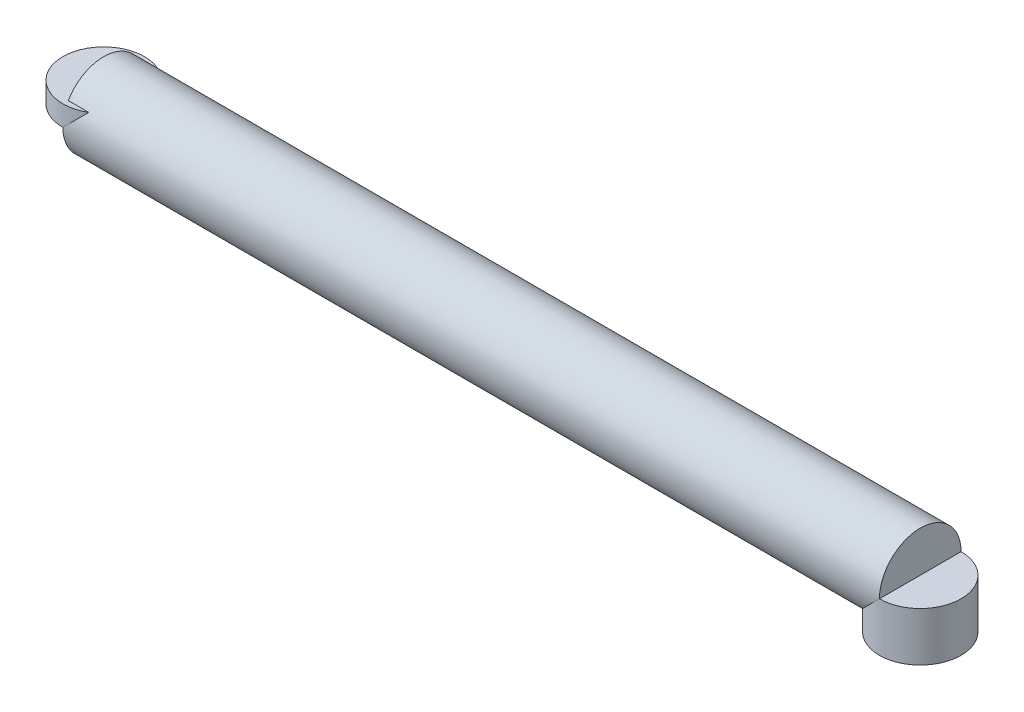
ISO-10303-21;
HEADER;
FILE_DESCRIPTION(('STEP AP214'),'2;1');
FILE_NAME('part.step','',(''),(''),'','','');
FILE_SCHEMA(('AUTOMOTIVE_DESIGN { 1 0 10303 214 1 1 1 1 }'));
ENDSEC;
DATA;
#1=APPLICATION_CONTEXT('core data for automotive mechanical design processes');
#2=APPLICATION_PROTOCOL_DEFINITION('international standard','automotive_design',2000,#1);
#3=PRODUCT_CONTEXT('',#1,'mechanical');
#4=PRODUCT('Part','Part','',(#3));
#5=PRODUCT_RELATED_PRODUCT_CATEGORY('part','',(#4));
#6=PRODUCT_DEFINITION_FORMATION('','',#4);
#7=PRODUCT_DEFINITION_CONTEXT('part definition',#1,'design');
#8=PRODUCT_DEFINITION('design','',#6,#7);
#9=PRODUCT_DEFINITION_SHAPE('','',#8);
#10=(LENGTH_UNIT() NAMED_UNIT(*) SI_UNIT(.MILLI.,.METRE.));
#11=(NAMED_UNIT(*) PLANE_ANGLE_UNIT() SI_UNIT($,.RADIAN.));
#12=(NAMED_UNIT(*) SI_UNIT($,.STERADIAN.) SOLID_ANGLE_UNIT());
#13=UNCERTAINTY_MEASURE_WITH_UNIT(LENGTH_MEASURE(1.E-05),#10,'distance_accuracy_value','');
#14=(GEOMETRIC_REPRESENTATION_CONTEXT(3) GLOBAL_UNCERTAINTY_ASSIGNED_CONTEXT((#13)) GLOBAL_UNIT_ASSIGNED_CONTEXT((#10,
#11,#12)) REPRESENTATION_CONTEXT('',''));
#15=CARTESIAN_POINT('',(0.,0.,0.));
#16=DIRECTION('',(0.,0.,1.));
#17=DIRECTION('',(1.,0.,0.));
#18=AXIS2_PLACEMENT_3D('',#15,#16,#17);
#19=CARTESIAN_POINT('',(24.,73.,16.7));
#20=DIRECTION('',(-1.,0.,0.));
#21=DIRECTION('',(0.,0.,1.));
#22=AXIS2_PLACEMENT_3D('',#19,#20,#21);
#23=CYLINDRICAL_SURFACE('',#22,1.);
#24=CARTESIAN_POINT('',(24.,73.,16.7));
#25=DIRECTION('',(1.,0.,0.));
#26=DIRECTION('',(0.,0.,-1.));
#27=AXIS2_PLACEMENT_3D('',#24,#25,#26);
#28=CIRCLE('',#27,1.);
#29=CARTESIAN_POINT('',(24.,73.,15.7));
#30=VERTEX_POINT('',#29);
#31=CARTESIAN_POINT('',(24.,73.,17.7));
#32=VERTEX_POINT('',#31);
#33=EDGE_CURVE('E103',#30,#32,#28,.T.);
#34=ORIENTED_EDGE('',*,*,#33,.F.);
#35=CARTESIAN_POINT('',(24.,73.,16.7));
#36=DIRECTION('',(0.707106781186547,-0.707106781186547,0.));
#37=DIRECTION('',(-0.707106781186547,-0.707106781186547,0.));
#38=AXIS2_PLACEMENT_3D('',#35,#36,#37);
#39=ELLIPSE('',#38,1.4142135623731,1.);
#40=EDGE_CURVE('E105',#30,#32,#39,.F.);
#41=ORIENTED_EDGE('',*,*,#40,.T.);
#42=EDGE_LOOP('',(#34,#41));
#43=FACE_BOUND('',#42,.T.);
#44=CARTESIAN_POINT('',(4.,73.,16.7));
#45=DIRECTION('',(-0.707106781186547,0.707106781186547,0.));
#46=DIRECTION('',(-0.707106781186547,-0.707106781186547,0.));
#47=AXIS2_PLACEMENT_3D('',#44,#45,#46);
#48=ELLIPSE('',#47,1.4142135623731,1.);
#49=CARTESIAN_POINT('',(4.5,73.5,15.8339745962156));
#50=VERTEX_POINT('',#49);
#51=CARTESIAN_POINT('',(4.,73.,15.7));
#52=VERTEX_POINT('',#51);
#53=EDGE_CURVE('E54',#50,#52,#48,.T.);
#54=ORIENTED_EDGE('',*,*,#53,.F.);
#55=DIRECTION('',(-1.,0.,0.));
#56=VECTOR('',#55,1.);
#57=CARTESIAN_POINT('',(24.,73.5,15.8339745962156));
#58=LINE('',#57,#56);
#59=CARTESIAN_POINT('',(4.,73.5,15.8339745962156));
#60=VERTEX_POINT('',#59);
#61=EDGE_CURVE('E101',#50,#60,#58,.T.);
#62=ORIENTED_EDGE('',*,*,#61,.T.);
#63=CARTESIAN_POINT('',(4.,73.,16.7));
#64=DIRECTION('',(1.,0.,0.));
#65=DIRECTION('',(0.,0.,-1.));
#66=AXIS2_PLACEMENT_3D('',#63,#64,#65);
#67=CIRCLE('',#66,1.);
#68=CARTESIAN_POINT('',(4.,73.5,17.5660254037844));
#69=VERTEX_POINT('',#68);
#70=EDGE_CURVE('E82',#60,#69,#67,.T.);
#71=ORIENTED_EDGE('',*,*,#70,.T.);
#72=DIRECTION('',(-1.,0.,0.));
#73=VECTOR('',#72,1.);
#74=CARTESIAN_POINT('',(24.,73.5,17.5660254037844));
#75=LINE('',#74,#73);
#76=CARTESIAN_POINT('',(4.5,73.5,17.5660254037844));
#77=VERTEX_POINT('',#76);
#78=EDGE_CURVE('E61',#69,#77,#75,.F.);
#79=ORIENTED_EDGE('',*,*,#78,.T.);
#80=CARTESIAN_POINT('',(4.,73.,17.7));
#81=VERTEX_POINT('',#80);
#82=EDGE_CURVE('E83',#81,#77,#48,.T.);
#83=ORIENTED_EDGE('',*,*,#82,.F.);
#84=EDGE_CURVE('E79',#81,#52,#67,.T.);
#85=ORIENTED_EDGE('',*,*,#84,.T.);
#86=EDGE_LOOP('',(#54,#62,#71,#79,#83,#85));
#87=FACE_BOUND('',#86,.T.);
#88=ADVANCED_FACE('F39',(#43,#87),#23,.T.);
#89=CARTESIAN_POINT('',(4.,73.,16.7));
#90=DIRECTION('',(1.,0.,0.));
#91=DIRECTION('',(0.,0.,-1.));
#92=AXIS2_PLACEMENT_3D('',#89,#90,#91);
#93=PLANE('',#92);
#94=DIRECTION('',(0.,0.,1.));
#95=VECTOR('',#94,1.);
#96=CARTESIAN_POINT('',(4.,73.,16.7));
#97=LINE('',#96,#95);
#98=EDGE_CURVE('E47',#52,#81,#97,.T.);
#99=ORIENTED_EDGE('',*,*,#98,.F.);
#100=ORIENTED_EDGE('',*,*,#84,.F.);
#101=EDGE_LOOP('',(#99,#100));
#102=FACE_BOUND('',#101,.T.);
#103=ADVANCED_FACE('F80',(#102),#93,.F.);
#104=CARTESIAN_POINT('',(24.,73.,16.7));
#105=DIRECTION('',(0.,-1.,0.));
#106=DIRECTION('',(0.,0.,-1.));
#107=AXIS2_PLACEMENT_3D('',#104,#105,#106);
#108=CYLINDRICAL_SURFACE('',#107,1.);
#109=CARTESIAN_POINT('',(24.,71.8,16.7));
#110=DIRECTION('',(0.,1.,0.));
#111=DIRECTION('',(0.,0.,1.));
#112=AXIS2_PLACEMENT_3D('',#109,#110,#111);
#113=CIRCLE('',#112,1.);
#114=CARTESIAN_POINT('',(24.,71.8,17.7));
#115=VERTEX_POINT('',#114);
#116=EDGE_CURVE('E109',#115,#115,#113,.T.);
#117=ORIENTED_EDGE('',*,*,#116,.T.);
#118=EDGE_LOOP('',(#117));
#119=FACE_BOUND('',#118,.T.);
#120=ORIENTED_EDGE('',*,*,#40,.F.);
#121=CARTESIAN_POINT('',(24.,73.,16.7));
#122=DIRECTION('',(0.,1.,0.));
#123=DIRECTION('',(0.,0.,1.));
#124=AXIS2_PLACEMENT_3D('',#121,#122,#123);
#125=CIRCLE('',#124,1.);
#126=EDGE_CURVE('E110',#32,#30,#125,.T.);
#127=ORIENTED_EDGE('',*,*,#126,.F.);
#128=EDGE_LOOP('',(#120,#127));
#129=FACE_BOUND('',#128,.T.);
#130=ADVANCED_FACE('F41',(#119,#129),#108,.T.);
#131=CARTESIAN_POINT('',(24.,73.,16.7));
#132=DIRECTION('',(0.,1.,0.));
#133=DIRECTION('',(0.,0.,1.));
#134=AXIS2_PLACEMENT_3D('',#131,#132,#133);
#135=PLANE('',#134);
#136=DIRECTION('',(0.,0.,-1.));
#137=VECTOR('',#136,1.);
#138=CARTESIAN_POINT('',(24.,73.,16.7));
#139=LINE('',#138,#137);
#140=EDGE_CURVE('E94',#32,#30,#139,.T.);
#141=ORIENTED_EDGE('',*,*,#140,.F.);
#142=ORIENTED_EDGE('',*,*,#126,.T.);
#143=EDGE_LOOP('',(#141,#142));
#144=FACE_BOUND('',#143,.T.);
#145=ADVANCED_FACE('F123',(#144),#135,.T.);
#146=CARTESIAN_POINT('',(24.,71.8,16.7));
#147=DIRECTION('',(0.,1.,0.));
#148=DIRECTION('',(0.,0.,1.));
#149=AXIS2_PLACEMENT_3D('',#146,#147,#148);
#150=PLANE('',#149);
#151=ORIENTED_EDGE('',*,*,#116,.F.);
#152=EDGE_LOOP('',(#151));
#153=FACE_BOUND('',#152,.T.);
#154=ADVANCED_FACE('F125',(#153),#150,.F.);
#155=CARTESIAN_POINT('',(24.,73.,16.7));
#156=DIRECTION('',(1.,0.,0.));
#157=DIRECTION('',(0.,0.,-1.));
#158=AXIS2_PLACEMENT_3D('',#155,#156,#157);
#159=PLANE('',#158);
#160=ORIENTED_EDGE('',*,*,#33,.T.);
#161=ORIENTED_EDGE('',*,*,#140,.T.);
#162=EDGE_LOOP('',(#160,#161));
#163=FACE_BOUND('',#162,.T.);
#164=ADVANCED_FACE('F117',(#163),#159,.T.);
#165=ORIENTED_EDGE('',*,*,#70,.F.);
#166=DIRECTION('',(0.,0.,1.));
#167=VECTOR('',#166,1.);
#168=CARTESIAN_POINT('',(4.,73.5,16.7));
#169=LINE('',#168,#167);
#170=EDGE_CURVE('E11',#60,#69,#169,.T.);
#171=ORIENTED_EDGE('',*,*,#170,.T.);
#172=EDGE_LOOP('',(#165,#171));
#173=FACE_BOUND('',#172,.T.);
#174=ADVANCED_FACE('F139',(#173),#93,.F.);
#175=CARTESIAN_POINT('',(4.,73.5,16.7));
#176=DIRECTION('',(0.,-1.,0.));
#177=DIRECTION('',(0.,0.,-1.));
#178=AXIS2_PLACEMENT_3D('',#175,#176,#177);
#179=CYLINDRICAL_SURFACE('',#178,1.);
#180=CARTESIAN_POINT('',(4.,73.,16.7));
#181=DIRECTION('',(0.,1.,0.));
#182=DIRECTION('',(0.,0.,1.));
#183=AXIS2_PLACEMENT_3D('',#180,#181,#182);
#184=CIRCLE('',#183,1.);
#185=EDGE_CURVE('E93',#52,#81,#184,.T.);
#186=ORIENTED_EDGE('',*,*,#185,.T.);
#187=ORIENTED_EDGE('',*,*,#82,.T.);
#188=CARTESIAN_POINT('',(4.,73.5,16.7));
#189=DIRECTION('',(0.,1.,0.));
#190=DIRECTION('',(0.,0.,1.));
#191=AXIS2_PLACEMENT_3D('',#188,#189,#190);
#192=CIRCLE('',#191,1.);
#193=EDGE_CURVE('E96',#50,#77,#192,.T.);
#194=ORIENTED_EDGE('',*,*,#193,.F.);
#195=ORIENTED_EDGE('',*,*,#53,.T.);
#196=EDGE_LOOP('',(#186,#187,#194,#195));
#197=FACE_BOUND('',#196,.T.);
#198=ADVANCED_FACE('F95',(#197),#179,.T.);
#199=CARTESIAN_POINT('',(4.,73.5,16.7));
#200=DIRECTION('',(0.,1.,0.));
#201=DIRECTION('',(0.,0.,1.));
#202=AXIS2_PLACEMENT_3D('',#199,#200,#201);
#203=PLANE('',#202);
#204=ORIENTED_EDGE('',*,*,#61,.F.);
#205=ORIENTED_EDGE('',*,*,#193,.T.);
#206=ORIENTED_EDGE('',*,*,#78,.F.);
#207=ORIENTED_EDGE('',*,*,#170,.F.);
#208=EDGE_LOOP('',(#204,#205,#206,#207));
#209=FACE_BOUND('',#208,.T.);
#210=ADVANCED_FACE('F147',(#209),#203,.T.);
#211=CARTESIAN_POINT('',(4.,73.,16.7));
#212=DIRECTION('',(0.,1.,0.));
#213=DIRECTION('',(0.,0.,1.));
#214=AXIS2_PLACEMENT_3D('',#211,#212,#213);
#215=PLANE('',#214);
#216=ORIENTED_EDGE('',*,*,#185,.F.);
#217=ORIENTED_EDGE('',*,*,#98,.T.);
#218=EDGE_LOOP('',(#216,#217));
#219=FACE_BOUND('',#218,.T.);
#220=ADVANCED_FACE('F92',(#219),#215,.F.);
#221=CLOSED_SHELL('',(#88,#103,#130,#145,#154,#164,#174,#198,#210,#220));
#222=MANIFOLD_SOLID_BREP('B2',#221);
#223=ADVANCED_BREP_SHAPE_REPRESENTATION('',(#18,#222),#14);
#224=SHAPE_DEFINITION_REPRESENTATION(#9,#223);
ENDSEC;
END-ISO-10303-21;
